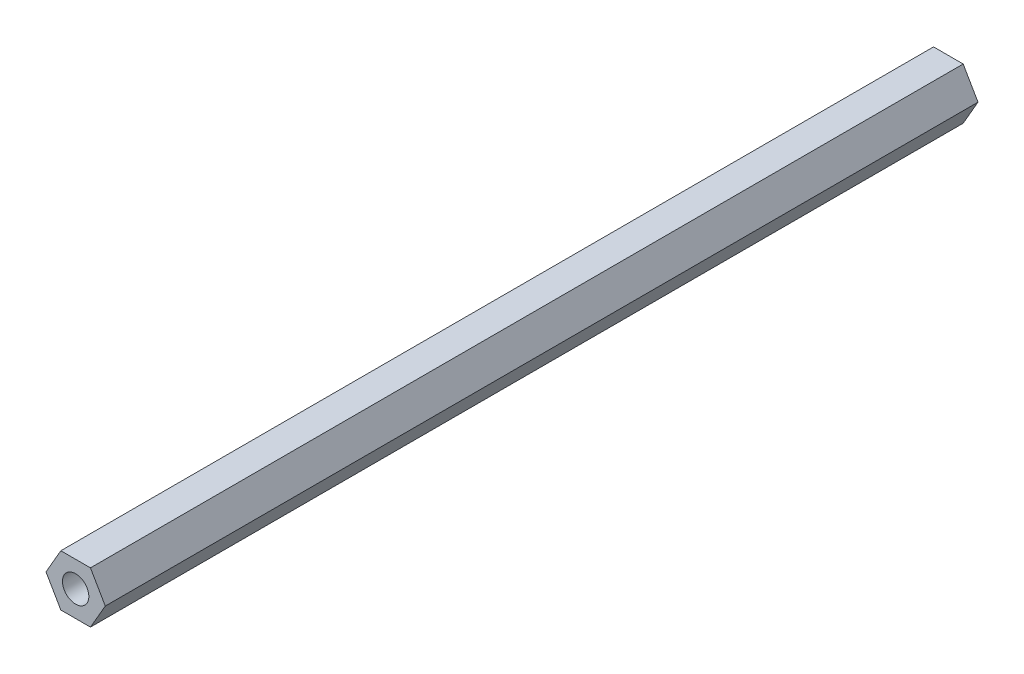
ISO-10303-21;
HEADER;
FILE_DESCRIPTION(('STEP AP214'),'2;1');
FILE_NAME('part.step','',(''),(''),'','','');
FILE_SCHEMA(('AUTOMOTIVE_DESIGN { 1 0 10303 214 1 1 1 1 }'));
ENDSEC;
DATA;
#1=APPLICATION_CONTEXT('core data for automotive mechanical design processes');
#2=APPLICATION_PROTOCOL_DEFINITION('international standard','automotive_design',2000,#1);
#3=PRODUCT_CONTEXT('',#1,'mechanical');
#4=PRODUCT('Part','Part','',(#3));
#5=PRODUCT_RELATED_PRODUCT_CATEGORY('part','',(#4));
#6=PRODUCT_DEFINITION_FORMATION('','',#4);
#7=PRODUCT_DEFINITION_CONTEXT('part definition',#1,'design');
#8=PRODUCT_DEFINITION('design','',#6,#7);
#9=PRODUCT_DEFINITION_SHAPE('','',#8);
#10=(LENGTH_UNIT() NAMED_UNIT(*) SI_UNIT(.MILLI.,.METRE.));
#11=(NAMED_UNIT(*) PLANE_ANGLE_UNIT() SI_UNIT($,.RADIAN.));
#12=(NAMED_UNIT(*) SI_UNIT($,.STERADIAN.) SOLID_ANGLE_UNIT());
#13=UNCERTAINTY_MEASURE_WITH_UNIT(LENGTH_MEASURE(1.E-05),#10,'distance_accuracy_value','');
#14=(GEOMETRIC_REPRESENTATION_CONTEXT(3) GLOBAL_UNCERTAINTY_ASSIGNED_CONTEXT((#13)) GLOBAL_UNIT_ASSIGNED_CONTEXT((#10,
#11,#12)) REPRESENTATION_CONTEXT('',''));
#15=CARTESIAN_POINT('',(0.,0.,0.));
#16=DIRECTION('',(0.,0.,1.));
#17=DIRECTION('',(1.,0.,0.));
#18=AXIS2_PLACEMENT_3D('',#15,#16,#17);
#19=CARTESIAN_POINT('',(0.,0.,215.9));
#20=DIRECTION('',(0.,0.,1.));
#21=DIRECTION('',(1.,0.,0.));
#22=AXIS2_PLACEMENT_3D('',#19,#20,#21);
#23=PLANE('',#22);
#24=DIRECTION('',(-0.5,-0.866025403784439,0.));
#25=VECTOR('',#24,1.);
#26=CARTESIAN_POINT('',(-3.66617420935412,6.35,215.9));
#27=LINE('',#26,#25);
#28=CARTESIAN_POINT('',(-3.66617420935412,6.35,215.9));
#29=VERTEX_POINT('',#28);
#30=CARTESIAN_POINT('',(-7.33234841870825,0.,215.9));
#31=VERTEX_POINT('',#30);
#32=EDGE_CURVE('E128',#29,#31,#27,.T.);
#33=ORIENTED_EDGE('',*,*,#32,.T.);
#34=DIRECTION('',(0.5,-0.866025403784438,0.));
#35=VECTOR('',#34,1.);
#36=CARTESIAN_POINT('',(-7.33234841870825,0.,215.9));
#37=LINE('',#36,#35);
#38=CARTESIAN_POINT('',(-3.66617420935412,-6.35000000000001,215.9));
#39=VERTEX_POINT('',#38);
#40=EDGE_CURVE('E86',#31,#39,#37,.T.);
#41=ORIENTED_EDGE('',*,*,#40,.T.);
#42=DIRECTION('',(1.,0.,0.));
#43=VECTOR('',#42,1.);
#44=CARTESIAN_POINT('',(-3.66617420935412,-6.35000000000001,215.9));
#45=LINE('',#44,#43);
#46=CARTESIAN_POINT('',(3.66617420935413,-6.35,215.9));
#47=VERTEX_POINT('',#46);
#48=EDGE_CURVE('E99',#39,#47,#45,.T.);
#49=ORIENTED_EDGE('',*,*,#48,.T.);
#50=DIRECTION('',(0.5,0.866025403784439,0.));
#51=VECTOR('',#50,1.);
#52=CARTESIAN_POINT('',(3.66617420935413,-6.35,215.9));
#53=LINE('',#52,#51);
#54=CARTESIAN_POINT('',(7.33234841870825,0.,215.9));
#55=VERTEX_POINT('',#54);
#56=EDGE_CURVE('E93',#47,#55,#53,.T.);
#57=ORIENTED_EDGE('',*,*,#56,.T.);
#58=DIRECTION('',(-0.5,0.866025403784438,0.));
#59=VECTOR('',#58,1.);
#60=CARTESIAN_POINT('',(7.33234841870825,0.,215.9));
#61=LINE('',#60,#59);
#62=CARTESIAN_POINT('',(3.66617420935412,6.35,215.9));
#63=VERTEX_POINT('',#62);
#64=EDGE_CURVE('E97',#55,#63,#61,.T.);
#65=ORIENTED_EDGE('',*,*,#64,.T.);
#66=DIRECTION('',(-1.,0.,0.));
#67=VECTOR('',#66,1.);
#68=CARTESIAN_POINT('',(3.66617420935412,6.35,215.9));
#69=LINE('',#68,#67);
#70=EDGE_CURVE('E49',#63,#29,#69,.T.);
#71=ORIENTED_EDGE('',*,*,#70,.T.);
#72=EDGE_LOOP('',(#33,#41,#49,#57,#65,#71));
#73=FACE_BOUND('',#72,.T.);
#74=CARTESIAN_POINT('',(0.,0.,215.9));
#75=DIRECTION('',(0.,0.,1.));
#76=DIRECTION('',(1.,0.,0.));
#77=AXIS2_PLACEMENT_3D('',#74,#75,#76);
#78=CIRCLE('',#77,3.2639);
#79=CARTESIAN_POINT('',(3.2639,0.,215.9));
#80=VERTEX_POINT('',#79);
#81=EDGE_CURVE('E121',#80,#80,#78,.T.);
#82=ORIENTED_EDGE('',*,*,#81,.F.);
#83=EDGE_LOOP('',(#82));
#84=FACE_BOUND('',#83,.T.);
#85=ADVANCED_FACE('F32',(#73,#84),#23,.T.);
#86=CARTESIAN_POINT('',(0.,0.,0.));
#87=DIRECTION('',(0.,0.,1.));
#88=DIRECTION('',(1.,0.,0.));
#89=AXIS2_PLACEMENT_3D('',#86,#87,#88);
#90=PLANE('',#89);
#91=DIRECTION('',(-0.5,-0.866025403784439,0.));
#92=VECTOR('',#91,1.);
#93=CARTESIAN_POINT('',(-3.66617420935412,6.35,0.));
#94=LINE('',#93,#92);
#95=CARTESIAN_POINT('',(-3.66617420935412,6.35,0.));
#96=VERTEX_POINT('',#95);
#97=CARTESIAN_POINT('',(-7.33234841870825,0.,0.));
#98=VERTEX_POINT('',#97);
#99=EDGE_CURVE('E117',#96,#98,#94,.T.);
#100=ORIENTED_EDGE('',*,*,#99,.F.);
#101=DIRECTION('',(-1.,0.,0.));
#102=VECTOR('',#101,1.);
#103=CARTESIAN_POINT('',(3.66617420935412,6.35,0.));
#104=LINE('',#103,#102);
#105=CARTESIAN_POINT('',(3.66617420935412,6.35,0.));
#106=VERTEX_POINT('',#105);
#107=EDGE_CURVE('E78',#106,#96,#104,.T.);
#108=ORIENTED_EDGE('',*,*,#107,.F.);
#109=DIRECTION('',(-0.5,0.866025403784438,0.));
#110=VECTOR('',#109,1.);
#111=CARTESIAN_POINT('',(7.33234841870825,0.,0.));
#112=LINE('',#111,#110);
#113=CARTESIAN_POINT('',(7.33234841870825,0.,0.));
#114=VERTEX_POINT('',#113);
#115=EDGE_CURVE('E72',#114,#106,#112,.T.);
#116=ORIENTED_EDGE('',*,*,#115,.F.);
#117=DIRECTION('',(0.5,0.866025403784439,0.));
#118=VECTOR('',#117,1.);
#119=CARTESIAN_POINT('',(3.66617420935413,-6.35,0.));
#120=LINE('',#119,#118);
#121=CARTESIAN_POINT('',(3.66617420935413,-6.35,0.));
#122=VERTEX_POINT('',#121);
#123=EDGE_CURVE('E107',#122,#114,#120,.T.);
#124=ORIENTED_EDGE('',*,*,#123,.F.);
#125=DIRECTION('',(1.,0.,0.));
#126=VECTOR('',#125,1.);
#127=CARTESIAN_POINT('',(-3.66617420935412,-6.35000000000001,0.));
#128=LINE('',#127,#126);
#129=CARTESIAN_POINT('',(-3.66617420935412,-6.35000000000001,0.));
#130=VERTEX_POINT('',#129);
#131=EDGE_CURVE('E123',#130,#122,#128,.T.);
#132=ORIENTED_EDGE('',*,*,#131,.F.);
#133=DIRECTION('',(0.5,-0.866025403784438,0.));
#134=VECTOR('',#133,1.);
#135=CARTESIAN_POINT('',(-7.33234841870825,0.,0.));
#136=LINE('',#135,#134);
#137=EDGE_CURVE('E120',#98,#130,#136,.T.);
#138=ORIENTED_EDGE('',*,*,#137,.F.);
#139=EDGE_LOOP('',(#100,#108,#116,#124,#132,#138));
#140=FACE_BOUND('',#139,.T.);
#141=CARTESIAN_POINT('',(0.,0.,0.));
#142=DIRECTION('',(0.,0.,1.));
#143=DIRECTION('',(1.,0.,0.));
#144=AXIS2_PLACEMENT_3D('',#141,#142,#143);
#145=CIRCLE('',#144,3.2639);
#146=CARTESIAN_POINT('',(3.2639,0.,0.));
#147=VERTEX_POINT('',#146);
#148=EDGE_CURVE('E221',#147,#147,#145,.T.);
#149=ORIENTED_EDGE('',*,*,#148,.T.);
#150=EDGE_LOOP('',(#149));
#151=FACE_BOUND('',#150,.T.);
#152=ADVANCED_FACE('F137',(#140,#151),#90,.F.);
#153=CARTESIAN_POINT('',(-3.66617420935412,6.35,215.9));
#154=DIRECTION('',(0.866025403784439,-0.5,0.));
#155=DIRECTION('',(0.5,0.866025403784439,0.));
#156=AXIS2_PLACEMENT_3D('',#153,#154,#155);
#157=PLANE('',#156);
#158=ORIENTED_EDGE('',*,*,#99,.T.);
#159=DIRECTION('',(0.,0.,-1.));
#160=VECTOR('',#159,1.);
#161=CARTESIAN_POINT('',(-7.33234841870825,0.,215.9));
#162=LINE('',#161,#160);
#163=EDGE_CURVE('E11',#31,#98,#162,.T.);
#164=ORIENTED_EDGE('',*,*,#163,.F.);
#165=ORIENTED_EDGE('',*,*,#32,.F.);
#166=DIRECTION('',(0.,0.,-1.));
#167=VECTOR('',#166,1.);
#168=CARTESIAN_POINT('',(-3.66617420935412,6.35,215.9));
#169=LINE('',#168,#167);
#170=EDGE_CURVE('E113',#29,#96,#169,.T.);
#171=ORIENTED_EDGE('',*,*,#170,.T.);
#172=EDGE_LOOP('',(#158,#164,#165,#171));
#173=FACE_BOUND('',#172,.T.);
#174=ADVANCED_FACE('F34',(#173),#157,.F.);
#175=CARTESIAN_POINT('',(-7.33234841870825,0.,215.9));
#176=DIRECTION('',(0.866025403784438,0.5,0.));
#177=DIRECTION('',(-0.5,0.866025403784439,0.));
#178=AXIS2_PLACEMENT_3D('',#175,#176,#177);
#179=PLANE('',#178);
#180=ORIENTED_EDGE('',*,*,#137,.T.);
#181=DIRECTION('',(0.,0.,-1.));
#182=VECTOR('',#181,1.);
#183=CARTESIAN_POINT('',(-3.66617420935412,-6.35000000000001,215.9));
#184=LINE('',#183,#182);
#185=EDGE_CURVE('E41',#39,#130,#184,.T.);
#186=ORIENTED_EDGE('',*,*,#185,.F.);
#187=ORIENTED_EDGE('',*,*,#40,.F.);
#188=ORIENTED_EDGE('',*,*,#163,.T.);
#189=EDGE_LOOP('',(#180,#186,#187,#188));
#190=FACE_BOUND('',#189,.T.);
#191=ADVANCED_FACE('F162',(#190),#179,.F.);
#192=CARTESIAN_POINT('',(-3.66617420935412,-6.35000000000001,215.9));
#193=DIRECTION('',(0.,1.,0.));
#194=DIRECTION('',(-1.,0.,0.));
#195=AXIS2_PLACEMENT_3D('',#192,#193,#194);
#196=PLANE('',#195);
#197=ORIENTED_EDGE('',*,*,#131,.T.);
#198=DIRECTION('',(0.,0.,-1.));
#199=VECTOR('',#198,1.);
#200=CARTESIAN_POINT('',(3.66617420935413,-6.35,215.9));
#201=LINE('',#200,#199);
#202=EDGE_CURVE('E108',#47,#122,#201,.T.);
#203=ORIENTED_EDGE('',*,*,#202,.F.);
#204=ORIENTED_EDGE('',*,*,#48,.F.);
#205=ORIENTED_EDGE('',*,*,#185,.T.);
#206=EDGE_LOOP('',(#197,#203,#204,#205));
#207=FACE_BOUND('',#206,.T.);
#208=ADVANCED_FACE('F134',(#207),#196,.F.);
#209=CARTESIAN_POINT('',(3.66617420935413,-6.35,215.9));
#210=DIRECTION('',(-0.866025403784439,0.5,0.));
#211=DIRECTION('',(-0.5,-0.866025403784439,0.));
#212=AXIS2_PLACEMENT_3D('',#209,#210,#211);
#213=PLANE('',#212);
#214=ORIENTED_EDGE('',*,*,#123,.T.);
#215=DIRECTION('',(0.,0.,-1.));
#216=VECTOR('',#215,1.);
#217=CARTESIAN_POINT('',(7.33234841870825,0.,215.9));
#218=LINE('',#217,#216);
#219=EDGE_CURVE('E104',#55,#114,#218,.T.);
#220=ORIENTED_EDGE('',*,*,#219,.F.);
#221=ORIENTED_EDGE('',*,*,#56,.F.);
#222=ORIENTED_EDGE('',*,*,#202,.T.);
#223=EDGE_LOOP('',(#214,#220,#221,#222));
#224=FACE_BOUND('',#223,.T.);
#225=ADVANCED_FACE('F105',(#224),#213,.F.);
#226=CARTESIAN_POINT('',(7.33234841870825,0.,215.9));
#227=DIRECTION('',(-0.866025403784438,-0.5,0.));
#228=DIRECTION('',(0.5,-0.866025403784438,0.));
#229=AXIS2_PLACEMENT_3D('',#226,#227,#228);
#230=PLANE('',#229);
#231=ORIENTED_EDGE('',*,*,#115,.T.);
#232=DIRECTION('',(0.,0.,-1.));
#233=VECTOR('',#232,1.);
#234=CARTESIAN_POINT('',(3.66617420935412,6.35,215.9));
#235=LINE('',#234,#233);
#236=EDGE_CURVE('E109',#63,#106,#235,.T.);
#237=ORIENTED_EDGE('',*,*,#236,.F.);
#238=ORIENTED_EDGE('',*,*,#64,.F.);
#239=ORIENTED_EDGE('',*,*,#219,.T.);
#240=EDGE_LOOP('',(#231,#237,#238,#239));
#241=FACE_BOUND('',#240,.T.);
#242=ADVANCED_FACE('F111',(#241),#230,.F.);
#243=CARTESIAN_POINT('',(3.66617420935412,6.35,215.9));
#244=DIRECTION('',(0.,-1.,0.));
#245=DIRECTION('',(0.,0.,-1.));
#246=AXIS2_PLACEMENT_3D('',#243,#244,#245);
#247=PLANE('',#246);
#248=ORIENTED_EDGE('',*,*,#107,.T.);
#249=ORIENTED_EDGE('',*,*,#170,.F.);
#250=ORIENTED_EDGE('',*,*,#70,.F.);
#251=ORIENTED_EDGE('',*,*,#236,.T.);
#252=EDGE_LOOP('',(#248,#249,#250,#251));
#253=FACE_BOUND('',#252,.T.);
#254=ADVANCED_FACE('F142',(#253),#247,.F.);
#255=CARTESIAN_POINT('',(0.,0.,215.9));
#256=DIRECTION('',(0.,0.,-1.));
#257=DIRECTION('',(-1.,0.,0.));
#258=AXIS2_PLACEMENT_3D('',#255,#256,#257);
#259=CYLINDRICAL_SURFACE('',#258,3.2639);
#260=ORIENTED_EDGE('',*,*,#81,.T.);
#261=EDGE_LOOP('',(#260));
#262=FACE_BOUND('',#261,.T.);
#263=ORIENTED_EDGE('',*,*,#148,.F.);
#264=EDGE_LOOP('',(#263));
#265=FACE_BOUND('',#264,.T.);
#266=ADVANCED_FACE('F144',(#262,#265),#259,.F.);
#267=CLOSED_SHELL('',(#85,#152,#174,#191,#208,#225,#242,#254,#266));
#268=MANIFOLD_SOLID_BREP('B2',#267);
#269=ADVANCED_BREP_SHAPE_REPRESENTATION('',(#18,#268),#14);
#270=SHAPE_DEFINITION_REPRESENTATION(#9,#269);
ENDSEC;
END-ISO-10303-21;
